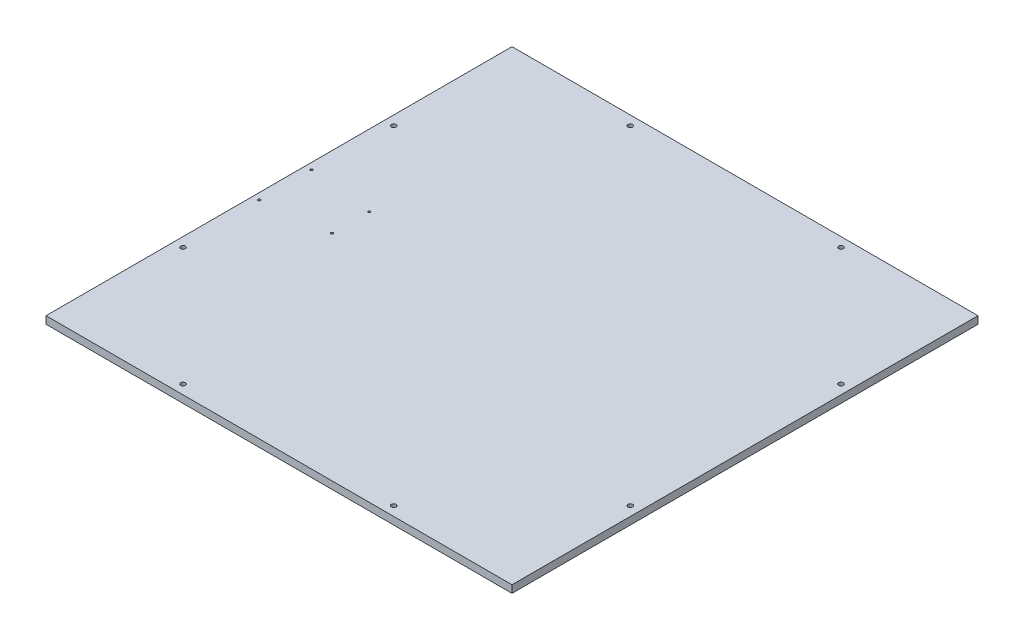
ISO-10303-21;
HEADER;
FILE_DESCRIPTION(('STEP AP214'),'2;1');
FILE_NAME('part.step','',(''),(''),'','','');
FILE_SCHEMA(('AUTOMOTIVE_DESIGN { 1 0 10303 214 1 1 1 1 }'));
ENDSEC;
DATA;
#1=APPLICATION_CONTEXT('core data for automotive mechanical design processes');
#2=APPLICATION_PROTOCOL_DEFINITION('international standard','automotive_design',2000,#1);
#3=PRODUCT_CONTEXT('',#1,'mechanical');
#4=PRODUCT('Part','Part','',(#3));
#5=PRODUCT_RELATED_PRODUCT_CATEGORY('part','',(#4));
#6=PRODUCT_DEFINITION_FORMATION('','',#4);
#7=PRODUCT_DEFINITION_CONTEXT('part definition',#1,'design');
#8=PRODUCT_DEFINITION('design','',#6,#7);
#9=PRODUCT_DEFINITION_SHAPE('','',#8);
#10=(LENGTH_UNIT() NAMED_UNIT(*) SI_UNIT(.MILLI.,.METRE.));
#11=(NAMED_UNIT(*) PLANE_ANGLE_UNIT() SI_UNIT($,.RADIAN.));
#12=(NAMED_UNIT(*) SI_UNIT($,.STERADIAN.) SOLID_ANGLE_UNIT());
#13=UNCERTAINTY_MEASURE_WITH_UNIT(LENGTH_MEASURE(1.E-05),#10,'distance_accuracy_value','');
#14=(GEOMETRIC_REPRESENTATION_CONTEXT(3) GLOBAL_UNCERTAINTY_ASSIGNED_CONTEXT((#13)) GLOBAL_UNIT_ASSIGNED_CONTEXT((#10,
#11,#12)) REPRESENTATION_CONTEXT('',''));
#15=CARTESIAN_POINT('',(0.,0.,0.));
#16=DIRECTION('',(0.,0.,1.));
#17=DIRECTION('',(1.,0.,0.));
#18=AXIS2_PLACEMENT_3D('',#15,#16,#17);
#19=CARTESIAN_POINT('',(250.,8.,-250.));
#20=DIRECTION('',(-1.,0.,0.));
#21=DIRECTION('',(0.,0.,1.));
#22=AXIS2_PLACEMENT_3D('',#19,#20,#21);
#23=PLANE('',#22);
#24=DIRECTION('',(0.,0.,-1.));
#25=VECTOR('',#24,1.);
#26=CARTESIAN_POINT('',(250.,0.,-250.));
#27=LINE('',#26,#25);
#28=CARTESIAN_POINT('',(250.,0.,250.));
#29=VERTEX_POINT('',#28);
#30=CARTESIAN_POINT('',(250.,0.,-250.));
#31=VERTEX_POINT('',#30);
#32=EDGE_CURVE('E96',#29,#31,#27,.T.);
#33=ORIENTED_EDGE('',*,*,#32,.T.);
#34=DIRECTION('',(0.,-1.,0.));
#35=VECTOR('',#34,1.);
#36=CARTESIAN_POINT('',(250.,8.,-250.));
#37=LINE('',#36,#35);
#38=CARTESIAN_POINT('',(250.,8.,-250.));
#39=VERTEX_POINT('',#38);
#40=EDGE_CURVE('E11',#39,#31,#37,.T.);
#41=ORIENTED_EDGE('',*,*,#40,.F.);
#42=DIRECTION('',(0.,0.,-1.));
#43=VECTOR('',#42,1.);
#44=CARTESIAN_POINT('',(250.,8.,-250.));
#45=LINE('',#44,#43);
#46=CARTESIAN_POINT('',(250.,8.,250.));
#47=VERTEX_POINT('',#46);
#48=EDGE_CURVE('E84',#47,#39,#45,.T.);
#49=ORIENTED_EDGE('',*,*,#48,.F.);
#50=DIRECTION('',(0.,-1.,0.));
#51=VECTOR('',#50,1.);
#52=CARTESIAN_POINT('',(250.,8.,250.));
#53=LINE('',#52,#51);
#54=EDGE_CURVE('E92',#47,#29,#53,.T.);
#55=ORIENTED_EDGE('',*,*,#54,.T.);
#56=EDGE_LOOP('',(#33,#41,#49,#55));
#57=FACE_BOUND('',#56,.T.);
#58=ADVANCED_FACE('F33',(#57),#23,.F.);
#59=CARTESIAN_POINT('',(-250.,8.,-250.));
#60=DIRECTION('',(0.,0.,1.));
#61=DIRECTION('',(1.,0.,0.));
#62=AXIS2_PLACEMENT_3D('',#59,#60,#61);
#63=PLANE('',#62);
#64=DIRECTION('',(-1.,0.,0.));
#65=VECTOR('',#64,1.);
#66=CARTESIAN_POINT('',(-250.,0.,-250.));
#67=LINE('',#66,#65);
#68=CARTESIAN_POINT('',(-250.,0.,-250.));
#69=VERTEX_POINT('',#68);
#70=EDGE_CURVE('E88',#31,#69,#67,.T.);
#71=ORIENTED_EDGE('',*,*,#70,.T.);
#72=DIRECTION('',(0.,-1.,0.));
#73=VECTOR('',#72,1.);
#74=CARTESIAN_POINT('',(-250.,8.,-250.));
#75=LINE('',#74,#73);
#76=CARTESIAN_POINT('',(-250.,8.,-250.));
#77=VERTEX_POINT('',#76);
#78=EDGE_CURVE('E41',#77,#69,#75,.T.);
#79=ORIENTED_EDGE('',*,*,#78,.F.);
#80=DIRECTION('',(-1.,0.,0.));
#81=VECTOR('',#80,1.);
#82=CARTESIAN_POINT('',(-250.,8.,-250.));
#83=LINE('',#82,#81);
#84=EDGE_CURVE('E79',#39,#77,#83,.T.);
#85=ORIENTED_EDGE('',*,*,#84,.F.);
#86=ORIENTED_EDGE('',*,*,#40,.T.);
#87=EDGE_LOOP('',(#71,#79,#85,#86));
#88=FACE_BOUND('',#87,.T.);
#89=ADVANCED_FACE('F87',(#88),#63,.F.);
#90=CARTESIAN_POINT('',(-250.,8.,-250.));
#91=DIRECTION('',(1.,0.,0.));
#92=DIRECTION('',(0.,0.,-1.));
#93=AXIS2_PLACEMENT_3D('',#90,#91,#92);
#94=PLANE('',#93);
#95=DIRECTION('',(0.,0.,1.));
#96=VECTOR('',#95,1.);
#97=CARTESIAN_POINT('',(-250.,0.,-250.));
#98=LINE('',#97,#96);
#99=CARTESIAN_POINT('',(-250.,0.,250.));
#100=VERTEX_POINT('',#99);
#101=EDGE_CURVE('E66',#69,#100,#98,.T.);
#102=ORIENTED_EDGE('',*,*,#101,.T.);
#103=DIRECTION('',(0.,-1.,0.));
#104=VECTOR('',#103,1.);
#105=CARTESIAN_POINT('',(-250.,8.,250.));
#106=LINE('',#105,#104);
#107=CARTESIAN_POINT('',(-250.,8.,250.));
#108=VERTEX_POINT('',#107);
#109=EDGE_CURVE('E89',#108,#100,#106,.T.);
#110=ORIENTED_EDGE('',*,*,#109,.F.);
#111=DIRECTION('',(0.,0.,1.));
#112=VECTOR('',#111,1.);
#113=CARTESIAN_POINT('',(-250.,8.,-250.));
#114=LINE('',#113,#112);
#115=EDGE_CURVE('E82',#77,#108,#114,.T.);
#116=ORIENTED_EDGE('',*,*,#115,.F.);
#117=ORIENTED_EDGE('',*,*,#78,.T.);
#118=EDGE_LOOP('',(#102,#110,#116,#117));
#119=FACE_BOUND('',#118,.T.);
#120=ADVANCED_FACE('F90',(#119),#94,.F.);
#121=CARTESIAN_POINT('',(-250.,8.,250.));
#122=DIRECTION('',(0.,0.,-1.));
#123=DIRECTION('',(-1.,0.,0.));
#124=AXIS2_PLACEMENT_3D('',#121,#122,#123);
#125=PLANE('',#124);
#126=DIRECTION('',(1.,0.,0.));
#127=VECTOR('',#126,1.);
#128=CARTESIAN_POINT('',(-250.,0.,250.));
#129=LINE('',#128,#127);
#130=EDGE_CURVE('E72',#100,#29,#129,.T.);
#131=ORIENTED_EDGE('',*,*,#130,.T.);
#132=ORIENTED_EDGE('',*,*,#54,.F.);
#133=DIRECTION('',(1.,0.,0.));
#134=VECTOR('',#133,1.);
#135=CARTESIAN_POINT('',(-250.,8.,250.));
#136=LINE('',#135,#134);
#137=EDGE_CURVE('E49',#108,#47,#136,.T.);
#138=ORIENTED_EDGE('',*,*,#137,.F.);
#139=ORIENTED_EDGE('',*,*,#109,.T.);
#140=EDGE_LOOP('',(#131,#132,#138,#139));
#141=FACE_BOUND('',#140,.T.);
#142=ADVANCED_FACE('F104',(#141),#125,.F.);
#143=CARTESIAN_POINT('',(0.,8.,0.));
#144=DIRECTION('',(0.,1.,0.));
#145=DIRECTION('',(0.,0.,1.));
#146=AXIS2_PLACEMENT_3D('',#143,#144,#145);
#147=PLANE('',#146);
#148=CARTESIAN_POINT('',(-243.151847811639,8.,-28.0000000000001));
#149=DIRECTION('',(0.,1.,0.));
#150=DIRECTION('',(0.,0.,1.));
#151=AXIS2_PLACEMENT_3D('',#148,#149,#150);
#152=CIRCLE('',#151,1.25000000000001);
#153=CARTESIAN_POINT('',(-243.151847811639,8.,-26.7500000000001));
#154=VERTEX_POINT('',#153);
#155=EDGE_CURVE('E174',#154,#154,#152,.T.);
#156=ORIENTED_EDGE('',*,*,#155,.F.);
#157=EDGE_LOOP('',(#156));
#158=FACE_BOUND('',#157,.T.);
#159=CARTESIAN_POINT('',(-173.151847811639,8.,-20.0000000000001));
#160=DIRECTION('',(0.,1.,0.));
#161=DIRECTION('',(0.,0.,1.));
#162=AXIS2_PLACEMENT_3D('',#159,#160,#161);
#163=CIRCLE('',#162,1.25000000000001);
#164=CARTESIAN_POINT('',(-173.151847811639,8.,-18.7500000000001));
#165=VERTEX_POINT('',#164);
#166=EDGE_CURVE('E168',#165,#165,#163,.T.);
#167=ORIENTED_EDGE('',*,*,#166,.F.);
#168=EDGE_LOOP('',(#167));
#169=FACE_BOUND('',#168,.T.);
#170=CARTESIAN_POINT('',(-173.151847811639,8.,20.));
#171=DIRECTION('',(0.,1.,0.));
#172=DIRECTION('',(0.,0.,-1.));
#173=AXIS2_PLACEMENT_3D('',#170,#171,#172);
#174=CIRCLE('',#173,1.25000000000001);
#175=CARTESIAN_POINT('',(-173.151847811639,8.,18.75));
#176=VERTEX_POINT('',#175);
#177=EDGE_CURVE('E161',#176,#176,#174,.T.);
#178=ORIENTED_EDGE('',*,*,#177,.F.);
#179=EDGE_LOOP('',(#178));
#180=FACE_BOUND('',#179,.T.);
#181=CARTESIAN_POINT('',(-243.151847811639,8.,28.));
#182=DIRECTION('',(0.,1.,0.));
#183=DIRECTION('',(0.,0.,-1.));
#184=AXIS2_PLACEMENT_3D('',#181,#182,#183);
#185=CIRCLE('',#184,1.25000000000001);
#186=CARTESIAN_POINT('',(-243.151847811639,8.,26.75));
#187=VERTEX_POINT('',#186);
#188=EDGE_CURVE('E162',#187,#187,#185,.T.);
#189=ORIENTED_EDGE('',*,*,#188,.F.);
#190=EDGE_LOOP('',(#189));
#191=FACE_BOUND('',#190,.T.);
#192=CARTESIAN_POINT('',(-113.,8.,240.));
#193=DIRECTION('',(0.,1.,0.));
#194=DIRECTION('',(0.,0.,-1.));
#195=AXIS2_PLACEMENT_3D('',#192,#193,#194);
#196=CIRCLE('',#195,2.49999999999996);
#197=CARTESIAN_POINT('',(-113.,8.,237.5));
#198=VERTEX_POINT('',#197);
#199=EDGE_CURVE('E120',#198,#198,#196,.T.);
#200=ORIENTED_EDGE('',*,*,#199,.F.);
#201=EDGE_LOOP('',(#200));
#202=FACE_BOUND('',#201,.T.);
#203=CARTESIAN_POINT('',(113.,8.,240.));
#204=DIRECTION('',(0.,1.,0.));
#205=DIRECTION('',(0.,0.,1.));
#206=AXIS2_PLACEMENT_3D('',#203,#204,#205);
#207=CIRCLE('',#206,2.49999999999992);
#208=CARTESIAN_POINT('',(113.,8.,242.5));
#209=VERTEX_POINT('',#208);
#210=EDGE_CURVE('E119',#209,#209,#207,.T.);
#211=ORIENTED_EDGE('',*,*,#210,.F.);
#212=EDGE_LOOP('',(#211));
#213=FACE_BOUND('',#212,.T.);
#214=CARTESIAN_POINT('',(240.,8.,113.));
#215=DIRECTION('',(0.,1.,0.));
#216=DIRECTION('',(0.,0.,-1.));
#217=AXIS2_PLACEMENT_3D('',#214,#215,#216);
#218=CIRCLE('',#217,2.5);
#219=CARTESIAN_POINT('',(240.,8.,110.5));
#220=VERTEX_POINT('',#219);
#221=EDGE_CURVE('E127',#220,#220,#218,.T.);
#222=ORIENTED_EDGE('',*,*,#221,.F.);
#223=EDGE_LOOP('',(#222));
#224=FACE_BOUND('',#223,.T.);
#225=CARTESIAN_POINT('',(240.,8.,-113.));
#226=DIRECTION('',(0.,1.,0.));
#227=DIRECTION('',(0.,0.,1.));
#228=AXIS2_PLACEMENT_3D('',#225,#226,#227);
#229=CIRCLE('',#228,2.49999999999998);
#230=CARTESIAN_POINT('',(240.,8.,-110.5));
#231=VERTEX_POINT('',#230);
#232=EDGE_CURVE('E133',#231,#231,#229,.T.);
#233=ORIENTED_EDGE('',*,*,#232,.F.);
#234=EDGE_LOOP('',(#233));
#235=FACE_BOUND('',#234,.T.);
#236=CARTESIAN_POINT('',(113.,8.,-240.));
#237=DIRECTION('',(0.,1.,0.));
#238=DIRECTION('',(0.,0.,-1.));
#239=AXIS2_PLACEMENT_3D('',#236,#237,#238);
#240=CIRCLE('',#239,2.50000000000001);
#241=CARTESIAN_POINT('',(113.,8.,-242.5));
#242=VERTEX_POINT('',#241);
#243=EDGE_CURVE('E139',#242,#242,#240,.T.);
#244=ORIENTED_EDGE('',*,*,#243,.F.);
#245=EDGE_LOOP('',(#244));
#246=FACE_BOUND('',#245,.T.);
#247=CARTESIAN_POINT('',(-113.,8.,-240.));
#248=DIRECTION('',(0.,1.,0.));
#249=DIRECTION('',(0.,0.,1.));
#250=AXIS2_PLACEMENT_3D('',#247,#248,#249);
#251=CIRCLE('',#250,2.50000000000003);
#252=CARTESIAN_POINT('',(-113.,8.,-237.5));
#253=VERTEX_POINT('',#252);
#254=EDGE_CURVE('E145',#253,#253,#251,.T.);
#255=ORIENTED_EDGE('',*,*,#254,.F.);
#256=EDGE_LOOP('',(#255));
#257=FACE_BOUND('',#256,.T.);
#258=CARTESIAN_POINT('',(-240.,8.,-113.));
#259=DIRECTION('',(0.,1.,0.));
#260=DIRECTION('',(0.,0.,-1.));
#261=AXIS2_PLACEMENT_3D('',#258,#259,#260);
#262=CIRCLE('',#261,2.5);
#263=CARTESIAN_POINT('',(-240.,8.,-115.5));
#264=VERTEX_POINT('',#263);
#265=EDGE_CURVE('E151',#264,#264,#262,.T.);
#266=ORIENTED_EDGE('',*,*,#265,.F.);
#267=EDGE_LOOP('',(#266));
#268=FACE_BOUND('',#267,.T.);
#269=CARTESIAN_POINT('',(-240.,8.,113.));
#270=DIRECTION('',(0.,1.,0.));
#271=DIRECTION('',(0.,0.,1.));
#272=AXIS2_PLACEMENT_3D('',#269,#270,#271);
#273=CIRCLE('',#272,2.5);
#274=CARTESIAN_POINT('',(-240.,8.,115.5));
#275=VERTEX_POINT('',#274);
#276=EDGE_CURVE('E112',#275,#275,#273,.T.);
#277=ORIENTED_EDGE('',*,*,#276,.F.);
#278=EDGE_LOOP('',(#277));
#279=FACE_BOUND('',#278,.T.);
#280=ORIENTED_EDGE('',*,*,#48,.T.);
#281=ORIENTED_EDGE('',*,*,#84,.T.);
#282=ORIENTED_EDGE('',*,*,#115,.T.);
#283=ORIENTED_EDGE('',*,*,#137,.T.);
#284=EDGE_LOOP('',(#280,#281,#282,#283));
#285=FACE_BOUND('',#284,.T.);
#286=ADVANCED_FACE('F80',(#158,#169,#180,#191,#202,#213,#224,#235,#246,#257,#268,#279,#285),
#147,.T.);
#287=CARTESIAN_POINT('',(0.,0.,0.));
#288=DIRECTION('',(0.,1.,0.));
#289=DIRECTION('',(0.,0.,1.));
#290=AXIS2_PLACEMENT_3D('',#287,#288,#289);
#291=PLANE('',#290);
#292=CARTESIAN_POINT('',(-243.151847811639,0.,-28.0000000000001));
#293=DIRECTION('',(0.,1.,0.));
#294=DIRECTION('',(0.,0.,1.));
#295=AXIS2_PLACEMENT_3D('',#292,#293,#294);
#296=CIRCLE('',#295,1.25000000000001);
#297=CARTESIAN_POINT('',(-243.151847811639,0.,-26.7500000000001));
#298=VERTEX_POINT('',#297);
#299=EDGE_CURVE('E123',#298,#298,#296,.F.);
#300=ORIENTED_EDGE('',*,*,#299,.F.);
#301=EDGE_LOOP('',(#300));
#302=FACE_BOUND('',#301,.T.);
#303=CARTESIAN_POINT('',(-173.151847811639,0.,-20.0000000000001));
#304=DIRECTION('',(0.,1.,0.));
#305=DIRECTION('',(0.,0.,1.));
#306=AXIS2_PLACEMENT_3D('',#303,#304,#305);
#307=CIRCLE('',#306,1.25000000000001);
#308=CARTESIAN_POINT('',(-173.151847811639,0.,-18.7500000000001));
#309=VERTEX_POINT('',#308);
#310=EDGE_CURVE('E171',#309,#309,#307,.F.);
#311=ORIENTED_EDGE('',*,*,#310,.F.);
#312=EDGE_LOOP('',(#311));
#313=FACE_BOUND('',#312,.T.);
#314=CARTESIAN_POINT('',(-173.151847811639,0.,20.));
#315=DIRECTION('',(0.,1.,0.));
#316=DIRECTION('',(0.,0.,1.));
#317=AXIS2_PLACEMENT_3D('',#314,#315,#316);
#318=CIRCLE('',#317,1.25000000000001);
#319=CARTESIAN_POINT('',(-173.151847811639,0.,21.25));
#320=VERTEX_POINT('',#319);
#321=EDGE_CURVE('E165',#320,#320,#318,.F.);
#322=ORIENTED_EDGE('',*,*,#321,.F.);
#323=EDGE_LOOP('',(#322));
#324=FACE_BOUND('',#323,.T.);
#325=CARTESIAN_POINT('',(-243.151847811639,0.,28.));
#326=DIRECTION('',(0.,1.,0.));
#327=DIRECTION('',(0.,0.,1.));
#328=AXIS2_PLACEMENT_3D('',#325,#326,#327);
#329=CIRCLE('',#328,1.25000000000001);
#330=CARTESIAN_POINT('',(-243.151847811639,0.,29.25));
#331=VERTEX_POINT('',#330);
#332=EDGE_CURVE('E158',#331,#331,#329,.F.);
#333=ORIENTED_EDGE('',*,*,#332,.F.);
#334=EDGE_LOOP('',(#333));
#335=FACE_BOUND('',#334,.T.);
#336=CARTESIAN_POINT('',(-113.,0.,240.));
#337=DIRECTION('',(0.,1.,0.));
#338=DIRECTION('',(0.,0.,1.));
#339=AXIS2_PLACEMENT_3D('',#336,#337,#338);
#340=CIRCLE('',#339,2.49999999999996);
#341=CARTESIAN_POINT('',(-113.,0.,242.5));
#342=VERTEX_POINT('',#341);
#343=EDGE_CURVE('E116',#342,#342,#340,.F.);
#344=ORIENTED_EDGE('',*,*,#343,.F.);
#345=EDGE_LOOP('',(#344));
#346=FACE_BOUND('',#345,.T.);
#347=CARTESIAN_POINT('',(113.,0.,240.));
#348=DIRECTION('',(0.,1.,0.));
#349=DIRECTION('',(0.,0.,1.));
#350=AXIS2_PLACEMENT_3D('',#347,#348,#349);
#351=CIRCLE('',#350,2.49999999999992);
#352=CARTESIAN_POINT('',(113.,0.,242.5));
#353=VERTEX_POINT('',#352);
#354=EDGE_CURVE('E124',#353,#353,#351,.F.);
#355=ORIENTED_EDGE('',*,*,#354,.F.);
#356=EDGE_LOOP('',(#355));
#357=FACE_BOUND('',#356,.T.);
#358=CARTESIAN_POINT('',(240.,0.,113.));
#359=DIRECTION('',(0.,1.,0.));
#360=DIRECTION('',(0.,0.,1.));
#361=AXIS2_PLACEMENT_3D('',#358,#359,#360);
#362=CIRCLE('',#361,2.5);
#363=CARTESIAN_POINT('',(240.,0.,115.5));
#364=VERTEX_POINT('',#363);
#365=EDGE_CURVE('E130',#364,#364,#362,.F.);
#366=ORIENTED_EDGE('',*,*,#365,.F.);
#367=EDGE_LOOP('',(#366));
#368=FACE_BOUND('',#367,.T.);
#369=CARTESIAN_POINT('',(240.,0.,-113.));
#370=DIRECTION('',(0.,1.,0.));
#371=DIRECTION('',(0.,0.,1.));
#372=AXIS2_PLACEMENT_3D('',#369,#370,#371);
#373=CIRCLE('',#372,2.49999999999998);
#374=CARTESIAN_POINT('',(240.,0.,-110.5));
#375=VERTEX_POINT('',#374);
#376=EDGE_CURVE('E136',#375,#375,#373,.F.);
#377=ORIENTED_EDGE('',*,*,#376,.F.);
#378=EDGE_LOOP('',(#377));
#379=FACE_BOUND('',#378,.T.);
#380=CARTESIAN_POINT('',(113.,0.,-240.));
#381=DIRECTION('',(0.,1.,0.));
#382=DIRECTION('',(0.,0.,1.));
#383=AXIS2_PLACEMENT_3D('',#380,#381,#382);
#384=CIRCLE('',#383,2.50000000000001);
#385=CARTESIAN_POINT('',(113.,0.,-237.5));
#386=VERTEX_POINT('',#385);
#387=EDGE_CURVE('E142',#386,#386,#384,.F.);
#388=ORIENTED_EDGE('',*,*,#387,.F.);
#389=EDGE_LOOP('',(#388));
#390=FACE_BOUND('',#389,.T.);
#391=CARTESIAN_POINT('',(-113.,0.,-240.));
#392=DIRECTION('',(0.,1.,0.));
#393=DIRECTION('',(0.,0.,1.));
#394=AXIS2_PLACEMENT_3D('',#391,#392,#393);
#395=CIRCLE('',#394,2.50000000000003);
#396=CARTESIAN_POINT('',(-113.,0.,-237.5));
#397=VERTEX_POINT('',#396);
#398=EDGE_CURVE('E148',#397,#397,#395,.F.);
#399=ORIENTED_EDGE('',*,*,#398,.F.);
#400=EDGE_LOOP('',(#399));
#401=FACE_BOUND('',#400,.T.);
#402=CARTESIAN_POINT('',(-240.,0.,-113.));
#403=DIRECTION('',(0.,1.,0.));
#404=DIRECTION('',(0.,0.,1.));
#405=AXIS2_PLACEMENT_3D('',#402,#403,#404);
#406=CIRCLE('',#405,2.5);
#407=CARTESIAN_POINT('',(-240.,0.,-110.5));
#408=VERTEX_POINT('',#407);
#409=EDGE_CURVE('E115',#408,#408,#406,.F.);
#410=ORIENTED_EDGE('',*,*,#409,.F.);
#411=EDGE_LOOP('',(#410));
#412=FACE_BOUND('',#411,.T.);
#413=CARTESIAN_POINT('',(-240.,0.,113.));
#414=DIRECTION('',(0.,1.,0.));
#415=DIRECTION('',(0.,0.,1.));
#416=AXIS2_PLACEMENT_3D('',#413,#414,#415);
#417=CIRCLE('',#416,2.5);
#418=CARTESIAN_POINT('',(-240.,0.,115.5));
#419=VERTEX_POINT('',#418);
#420=EDGE_CURVE('E99',#419,#419,#417,.F.);
#421=ORIENTED_EDGE('',*,*,#420,.F.);
#422=EDGE_LOOP('',(#421));
#423=FACE_BOUND('',#422,.T.);
#424=ORIENTED_EDGE('',*,*,#32,.F.);
#425=ORIENTED_EDGE('',*,*,#130,.F.);
#426=ORIENTED_EDGE('',*,*,#101,.F.);
#427=ORIENTED_EDGE('',*,*,#70,.F.);
#428=EDGE_LOOP('',(#424,#425,#426,#427));
#429=FACE_BOUND('',#428,.T.);
#430=ADVANCED_FACE('F107',(#302,#313,#324,#335,#346,#357,#368,#379,#390,#401,#412,#423,#429),
#291,.F.);
#431=CARTESIAN_POINT('',(-240.,-7.07106781186556,113.));
#432=DIRECTION('',(0.,1.,0.));
#433=DIRECTION('',(0.,0.,1.));
#434=AXIS2_PLACEMENT_3D('',#431,#432,#433);
#435=CYLINDRICAL_SURFACE('',#434,2.5);
#436=ORIENTED_EDGE('',*,*,#420,.T.);
#437=EDGE_LOOP('',(#436));
#438=FACE_BOUND('',#437,.T.);
#439=ORIENTED_EDGE('',*,*,#276,.T.);
#440=EDGE_LOOP('',(#439));
#441=FACE_BOUND('',#440,.T.);
#442=ADVANCED_FACE('F209',(#438,#441),#435,.F.);
#443=CARTESIAN_POINT('',(-240.,-7.07106781186556,-113.));
#444=DIRECTION('',(0.,1.,0.));
#445=DIRECTION('',(0.,0.,1.));
#446=AXIS2_PLACEMENT_3D('',#443,#444,#445);
#447=CYLINDRICAL_SURFACE('',#446,2.5);
#448=ORIENTED_EDGE('',*,*,#409,.T.);
#449=EDGE_LOOP('',(#448));
#450=FACE_BOUND('',#449,.T.);
#451=ORIENTED_EDGE('',*,*,#265,.T.);
#452=EDGE_LOOP('',(#451));
#453=FACE_BOUND('',#452,.T.);
#454=ADVANCED_FACE('F211',(#450,#453),#447,.F.);
#455=CARTESIAN_POINT('',(-113.,-7.07106781186556,-240.));
#456=DIRECTION('',(0.,1.,0.));
#457=DIRECTION('',(0.,0.,1.));
#458=AXIS2_PLACEMENT_3D('',#455,#456,#457);
#459=CYLINDRICAL_SURFACE('',#458,2.50000000000003);
#460=ORIENTED_EDGE('',*,*,#398,.T.);
#461=EDGE_LOOP('',(#460));
#462=FACE_BOUND('',#461,.T.);
#463=ORIENTED_EDGE('',*,*,#254,.T.);
#464=EDGE_LOOP('',(#463));
#465=FACE_BOUND('',#464,.T.);
#466=ADVANCED_FACE('F218',(#462,#465),#459,.F.);
#467=CARTESIAN_POINT('',(113.,-7.07106781186556,-240.));
#468=DIRECTION('',(0.,1.,0.));
#469=DIRECTION('',(0.,0.,1.));
#470=AXIS2_PLACEMENT_3D('',#467,#468,#469);
#471=CYLINDRICAL_SURFACE('',#470,2.50000000000001);
#472=ORIENTED_EDGE('',*,*,#387,.T.);
#473=EDGE_LOOP('',(#472));
#474=FACE_BOUND('',#473,.T.);
#475=ORIENTED_EDGE('',*,*,#243,.T.);
#476=EDGE_LOOP('',(#475));
#477=FACE_BOUND('',#476,.T.);
#478=ADVANCED_FACE('F297',(#474,#477),#471,.F.);
#479=CARTESIAN_POINT('',(240.,-7.07106781186556,-113.));
#480=DIRECTION('',(0.,1.,0.));
#481=DIRECTION('',(0.,0.,1.));
#482=AXIS2_PLACEMENT_3D('',#479,#480,#481);
#483=CYLINDRICAL_SURFACE('',#482,2.49999999999998);
#484=ORIENTED_EDGE('',*,*,#376,.T.);
#485=EDGE_LOOP('',(#484));
#486=FACE_BOUND('',#485,.T.);
#487=ORIENTED_EDGE('',*,*,#232,.T.);
#488=EDGE_LOOP('',(#487));
#489=FACE_BOUND('',#488,.T.);
#490=ADVANCED_FACE('F301',(#486,#489),#483,.F.);
#491=CARTESIAN_POINT('',(240.,-7.07106781186556,113.));
#492=DIRECTION('',(0.,1.,0.));
#493=DIRECTION('',(0.,0.,1.));
#494=AXIS2_PLACEMENT_3D('',#491,#492,#493);
#495=CYLINDRICAL_SURFACE('',#494,2.5);
#496=ORIENTED_EDGE('',*,*,#365,.T.);
#497=EDGE_LOOP('',(#496));
#498=FACE_BOUND('',#497,.T.);
#499=ORIENTED_EDGE('',*,*,#221,.T.);
#500=EDGE_LOOP('',(#499));
#501=FACE_BOUND('',#500,.T.);
#502=ADVANCED_FACE('F305',(#498,#501),#495,.F.);
#503=CARTESIAN_POINT('',(113.,-7.07106781186556,240.));
#504=DIRECTION('',(0.,1.,0.));
#505=DIRECTION('',(0.,0.,1.));
#506=AXIS2_PLACEMENT_3D('',#503,#504,#505);
#507=CYLINDRICAL_SURFACE('',#506,2.49999999999992);
#508=ORIENTED_EDGE('',*,*,#354,.T.);
#509=EDGE_LOOP('',(#508));
#510=FACE_BOUND('',#509,.T.);
#511=ORIENTED_EDGE('',*,*,#210,.T.);
#512=EDGE_LOOP('',(#511));
#513=FACE_BOUND('',#512,.T.);
#514=ADVANCED_FACE('F309',(#510,#513),#507,.F.);
#515=CARTESIAN_POINT('',(-113.,-7.07106781186556,240.));
#516=DIRECTION('',(0.,1.,0.));
#517=DIRECTION('',(0.,0.,1.));
#518=AXIS2_PLACEMENT_3D('',#515,#516,#517);
#519=CYLINDRICAL_SURFACE('',#518,2.49999999999996);
#520=ORIENTED_EDGE('',*,*,#343,.T.);
#521=EDGE_LOOP('',(#520));
#522=FACE_BOUND('',#521,.T.);
#523=ORIENTED_EDGE('',*,*,#199,.T.);
#524=EDGE_LOOP('',(#523));
#525=FACE_BOUND('',#524,.T.);
#526=ADVANCED_FACE('F259',(#522,#525),#519,.F.);
#527=CARTESIAN_POINT('',(-243.151847811639,-3.53553390593276,28.));
#528=DIRECTION('',(0.,1.,0.));
#529=DIRECTION('',(0.,0.,1.));
#530=AXIS2_PLACEMENT_3D('',#527,#528,#529);
#531=CYLINDRICAL_SURFACE('',#530,1.25000000000001);
#532=ORIENTED_EDGE('',*,*,#332,.T.);
#533=EDGE_LOOP('',(#532));
#534=FACE_BOUND('',#533,.T.);
#535=ORIENTED_EDGE('',*,*,#188,.T.);
#536=EDGE_LOOP('',(#535));
#537=FACE_BOUND('',#536,.T.);
#538=ADVANCED_FACE('F253',(#534,#537),#531,.F.);
#539=CARTESIAN_POINT('',(-173.151847811639,-3.53553390593276,20.));
#540=DIRECTION('',(0.,1.,0.));
#541=DIRECTION('',(0.,0.,1.));
#542=AXIS2_PLACEMENT_3D('',#539,#540,#541);
#543=CYLINDRICAL_SURFACE('',#542,1.25000000000001);
#544=ORIENTED_EDGE('',*,*,#321,.T.);
#545=EDGE_LOOP('',(#544));
#546=FACE_BOUND('',#545,.T.);
#547=ORIENTED_EDGE('',*,*,#177,.T.);
#548=EDGE_LOOP('',(#547));
#549=FACE_BOUND('',#548,.T.);
#550=ADVANCED_FACE('F258',(#546,#549),#543,.F.);
#551=CARTESIAN_POINT('',(-173.151847811639,-3.53553390593276,-20.0000000000001));
#552=DIRECTION('',(0.,1.,0.));
#553=DIRECTION('',(0.,0.,1.));
#554=AXIS2_PLACEMENT_3D('',#551,#552,#553);
#555=CYLINDRICAL_SURFACE('',#554,1.25000000000001);
#556=ORIENTED_EDGE('',*,*,#310,.T.);
#557=EDGE_LOOP('',(#556));
#558=FACE_BOUND('',#557,.T.);
#559=ORIENTED_EDGE('',*,*,#166,.T.);
#560=EDGE_LOOP('',(#559));
#561=FACE_BOUND('',#560,.T.);
#562=ADVANCED_FACE('F271',(#558,#561),#555,.F.);
#563=CARTESIAN_POINT('',(-243.151847811639,-3.53553390593276,-28.0000000000001));
#564=DIRECTION('',(0.,1.,0.));
#565=DIRECTION('',(0.,0.,1.));
#566=AXIS2_PLACEMENT_3D('',#563,#564,#565);
#567=CYLINDRICAL_SURFACE('',#566,1.25000000000001);
#568=ORIENTED_EDGE('',*,*,#299,.T.);
#569=EDGE_LOOP('',(#568));
#570=FACE_BOUND('',#569,.T.);
#571=ORIENTED_EDGE('',*,*,#155,.T.);
#572=EDGE_LOOP('',(#571));
#573=FACE_BOUND('',#572,.T.);
#574=ADVANCED_FACE('F182',(#570,#573),#567,.F.);
#575=CLOSED_SHELL('',(#58,#89,#120,#142,#286,#430,#442,#454,#466,#478,#490,#502,#514,#526,#538,
#550,#562,#574));
#576=MANIFOLD_SOLID_BREP('B2',#575);
#577=ADVANCED_BREP_SHAPE_REPRESENTATION('',(#18,#576),#14);
#578=SHAPE_DEFINITION_REPRESENTATION(#9,#577);
ENDSEC;
END-ISO-10303-21;
